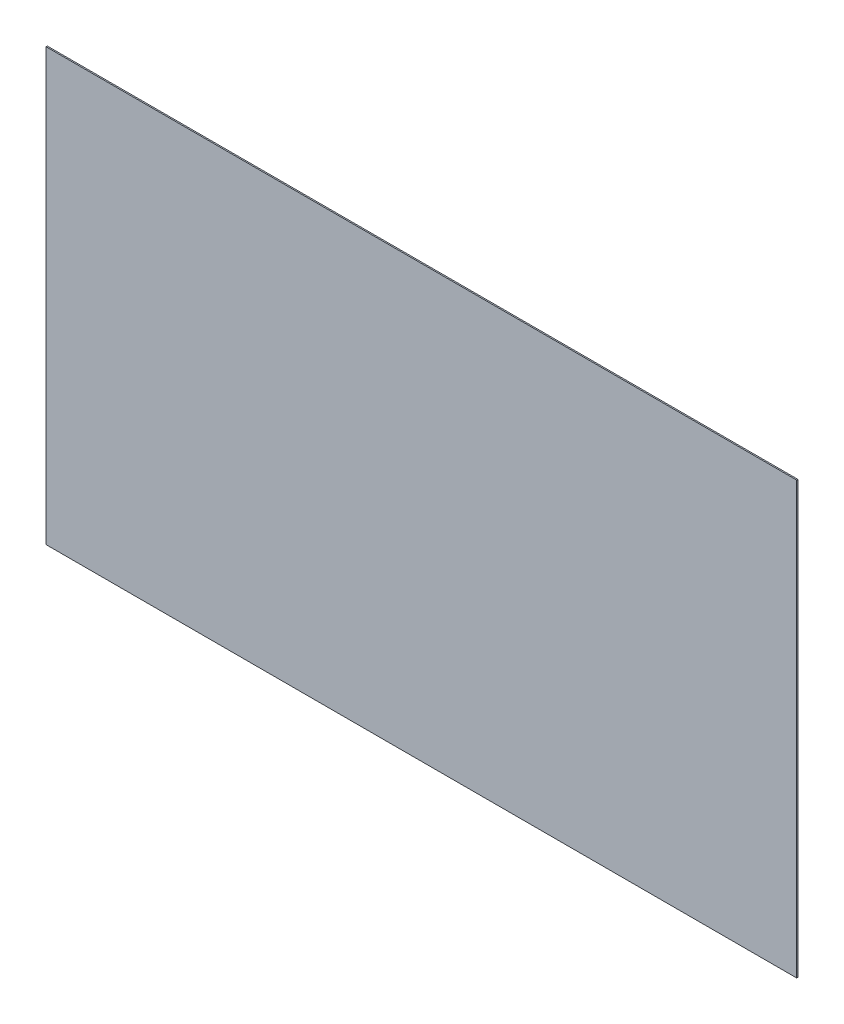
ISO-10303-21;
HEADER;
FILE_DESCRIPTION(('STEP AP214'),'2;1');
FILE_NAME('part.step','',(''),(''),'','','');
FILE_SCHEMA(('AUTOMOTIVE_DESIGN { 1 0 10303 214 1 1 1 1 }'));
ENDSEC;
DATA;
#1=APPLICATION_CONTEXT('core data for automotive mechanical design processes');
#2=APPLICATION_PROTOCOL_DEFINITION('international standard','automotive_design',2000,#1);
#3=PRODUCT_CONTEXT('',#1,'mechanical');
#4=PRODUCT('Part','Part','',(#3));
#5=PRODUCT_RELATED_PRODUCT_CATEGORY('part','',(#4));
#6=PRODUCT_DEFINITION_FORMATION('','',#4);
#7=PRODUCT_DEFINITION_CONTEXT('part definition',#1,'design');
#8=PRODUCT_DEFINITION('design','',#6,#7);
#9=PRODUCT_DEFINITION_SHAPE('','',#8);
#10=(LENGTH_UNIT() NAMED_UNIT(*) SI_UNIT(.MILLI.,.METRE.));
#11=(NAMED_UNIT(*) PLANE_ANGLE_UNIT() SI_UNIT($,.RADIAN.));
#12=(NAMED_UNIT(*) SI_UNIT($,.STERADIAN.) SOLID_ANGLE_UNIT());
#13=UNCERTAINTY_MEASURE_WITH_UNIT(LENGTH_MEASURE(1.E-05),#10,'distance_accuracy_value','');
#14=(GEOMETRIC_REPRESENTATION_CONTEXT(3) GLOBAL_UNCERTAINTY_ASSIGNED_CONTEXT((#13)) GLOBAL_UNIT_ASSIGNED_CONTEXT((#10,
#11,#12)) REPRESENTATION_CONTEXT('',''));
#15=CARTESIAN_POINT('',(0.,0.,0.));
#16=DIRECTION('',(0.,0.,1.));
#17=DIRECTION('',(1.,0.,0.));
#18=AXIS2_PLACEMENT_3D('',#15,#16,#17);
#19=CARTESIAN_POINT('',(298.45,-171.45,1.));
#20=DIRECTION('',(-1.,0.,0.));
#21=DIRECTION('',(0.,0.,1.));
#22=AXIS2_PLACEMENT_3D('',#19,#20,#21);
#23=PLANE('',#22);
#24=DIRECTION('',(0.,1.,0.));
#25=VECTOR('',#24,1.);
#26=CARTESIAN_POINT('',(298.45,-171.45,0.));
#27=LINE('',#26,#25);
#28=CARTESIAN_POINT('',(298.45,-171.45,0.));
#29=VERTEX_POINT('',#28);
#30=CARTESIAN_POINT('',(298.45,171.45,0.));
#31=VERTEX_POINT('',#30);
#32=EDGE_CURVE('E98',#29,#31,#27,.T.);
#33=ORIENTED_EDGE('',*,*,#32,.T.);
#34=DIRECTION('',(0.,0.,-1.));
#35=VECTOR('',#34,1.);
#36=CARTESIAN_POINT('',(298.45,171.45,1.));
#37=LINE('',#36,#35);
#38=CARTESIAN_POINT('',(298.45,171.45,1.));
#39=VERTEX_POINT('',#38);
#40=EDGE_CURVE('E11',#39,#31,#37,.T.);
#41=ORIENTED_EDGE('',*,*,#40,.F.);
#42=DIRECTION('',(0.,1.,0.));
#43=VECTOR('',#42,1.);
#44=CARTESIAN_POINT('',(298.45,-171.45,1.));
#45=LINE('',#44,#43);
#46=CARTESIAN_POINT('',(298.45,-171.45,1.));
#47=VERTEX_POINT('',#46);
#48=EDGE_CURVE('E86',#47,#39,#45,.T.);
#49=ORIENTED_EDGE('',*,*,#48,.F.);
#50=DIRECTION('',(0.,0.,-1.));
#51=VECTOR('',#50,1.);
#52=CARTESIAN_POINT('',(298.45,-171.45,1.));
#53=LINE('',#52,#51);
#54=EDGE_CURVE('E94',#47,#29,#53,.T.);
#55=ORIENTED_EDGE('',*,*,#54,.T.);
#56=EDGE_LOOP('',(#33,#41,#49,#55));
#57=FACE_BOUND('',#56,.T.);
#58=ADVANCED_FACE('F35',(#57),#23,.F.);
#59=CARTESIAN_POINT('',(-298.45,171.45,1.));
#60=DIRECTION('',(0.,-1.,0.));
#61=DIRECTION('',(0.,0.,-1.));
#62=AXIS2_PLACEMENT_3D('',#59,#60,#61);
#63=PLANE('',#62);
#64=DIRECTION('',(-1.,0.,0.));
#65=VECTOR('',#64,1.);
#66=CARTESIAN_POINT('',(-298.45,171.45,0.));
#67=LINE('',#66,#65);
#68=CARTESIAN_POINT('',(-298.45,171.45,0.));
#69=VERTEX_POINT('',#68);
#70=EDGE_CURVE('E90',#31,#69,#67,.T.);
#71=ORIENTED_EDGE('',*,*,#70,.T.);
#72=DIRECTION('',(0.,0.,-1.));
#73=VECTOR('',#72,1.);
#74=CARTESIAN_POINT('',(-298.45,171.45,1.));
#75=LINE('',#74,#73);
#76=CARTESIAN_POINT('',(-298.45,171.45,1.));
#77=VERTEX_POINT('',#76);
#78=EDGE_CURVE('E43',#77,#69,#75,.T.);
#79=ORIENTED_EDGE('',*,*,#78,.F.);
#80=DIRECTION('',(-1.,0.,0.));
#81=VECTOR('',#80,1.);
#82=CARTESIAN_POINT('',(-298.45,171.45,1.));
#83=LINE('',#82,#81);
#84=EDGE_CURVE('E81',#39,#77,#83,.T.);
#85=ORIENTED_EDGE('',*,*,#84,.F.);
#86=ORIENTED_EDGE('',*,*,#40,.T.);
#87=EDGE_LOOP('',(#71,#79,#85,#86));
#88=FACE_BOUND('',#87,.T.);
#89=ADVANCED_FACE('F89',(#88),#63,.F.);
#90=CARTESIAN_POINT('',(-298.45,-171.45,1.));
#91=DIRECTION('',(1.,0.,0.));
#92=DIRECTION('',(0.,0.,-1.));
#93=AXIS2_PLACEMENT_3D('',#90,#91,#92);
#94=PLANE('',#93);
#95=DIRECTION('',(0.,-1.,0.));
#96=VECTOR('',#95,1.);
#97=CARTESIAN_POINT('',(-298.45,-171.45,0.));
#98=LINE('',#97,#96);
#99=CARTESIAN_POINT('',(-298.45,-171.45,0.));
#100=VERTEX_POINT('',#99);
#101=EDGE_CURVE('E68',#69,#100,#98,.T.);
#102=ORIENTED_EDGE('',*,*,#101,.T.);
#103=DIRECTION('',(0.,0.,-1.));
#104=VECTOR('',#103,1.);
#105=CARTESIAN_POINT('',(-298.45,-171.45,1.));
#106=LINE('',#105,#104);
#107=CARTESIAN_POINT('',(-298.45,-171.45,1.));
#108=VERTEX_POINT('',#107);
#109=EDGE_CURVE('E91',#108,#100,#106,.T.);
#110=ORIENTED_EDGE('',*,*,#109,.F.);
#111=DIRECTION('',(0.,-1.,0.));
#112=VECTOR('',#111,1.);
#113=CARTESIAN_POINT('',(-298.45,-171.45,1.));
#114=LINE('',#113,#112);
#115=EDGE_CURVE('E84',#77,#108,#114,.T.);
#116=ORIENTED_EDGE('',*,*,#115,.F.);
#117=ORIENTED_EDGE('',*,*,#78,.T.);
#118=EDGE_LOOP('',(#102,#110,#116,#117));
#119=FACE_BOUND('',#118,.T.);
#120=ADVANCED_FACE('F92',(#119),#94,.F.);
#121=CARTESIAN_POINT('',(-298.45,-171.45,1.));
#122=DIRECTION('',(0.,1.,0.));
#123=DIRECTION('',(0.,0.,1.));
#124=AXIS2_PLACEMENT_3D('',#121,#122,#123);
#125=PLANE('',#124);
#126=DIRECTION('',(1.,0.,0.));
#127=VECTOR('',#126,1.);
#128=CARTESIAN_POINT('',(-298.45,-171.45,0.));
#129=LINE('',#128,#127);
#130=EDGE_CURVE('E74',#100,#29,#129,.T.);
#131=ORIENTED_EDGE('',*,*,#130,.T.);
#132=ORIENTED_EDGE('',*,*,#54,.F.);
#133=DIRECTION('',(1.,0.,0.));
#134=VECTOR('',#133,1.);
#135=CARTESIAN_POINT('',(-298.45,-171.45,1.));
#136=LINE('',#135,#134);
#137=EDGE_CURVE('E51',#108,#47,#136,.T.);
#138=ORIENTED_EDGE('',*,*,#137,.F.);
#139=ORIENTED_EDGE('',*,*,#109,.T.);
#140=EDGE_LOOP('',(#131,#132,#138,#139));
#141=FACE_BOUND('',#140,.T.);
#142=ADVANCED_FACE('F105',(#141),#125,.F.);
#143=CARTESIAN_POINT('',(0.,0.,1.));
#144=DIRECTION('',(0.,0.,-1.));
#145=DIRECTION('',(-1.,0.,0.));
#146=AXIS2_PLACEMENT_3D('',#143,#144,#145);
#147=PLANE('',#146);
#148=ORIENTED_EDGE('',*,*,#48,.T.);
#149=ORIENTED_EDGE('',*,*,#84,.T.);
#150=ORIENTED_EDGE('',*,*,#115,.T.);
#151=ORIENTED_EDGE('',*,*,#137,.T.);
#152=EDGE_LOOP('',(#148,#149,#150,#151));
#153=FACE_BOUND('',#152,.T.);
#154=ADVANCED_FACE('F82',(#153),#147,.F.);
#155=CARTESIAN_POINT('',(0.,0.,0.));
#156=DIRECTION('',(0.,0.,-1.));
#157=DIRECTION('',(-1.,0.,0.));
#158=AXIS2_PLACEMENT_3D('',#155,#156,#157);
#159=PLANE('',#158);
#160=ORIENTED_EDGE('',*,*,#32,.F.);
#161=ORIENTED_EDGE('',*,*,#130,.F.);
#162=ORIENTED_EDGE('',*,*,#101,.F.);
#163=ORIENTED_EDGE('',*,*,#70,.F.);
#164=EDGE_LOOP('',(#160,#161,#162,#163));
#165=FACE_BOUND('',#164,.T.);
#166=ADVANCED_FACE('F108',(#165),#159,.T.);
#167=CLOSED_SHELL('',(#58,#89,#120,#142,#154,#166));
#168=MANIFOLD_SOLID_BREP('B2',#167);
#169=ADVANCED_BREP_SHAPE_REPRESENTATION('',(#18,#168),#14);
#170=SHAPE_DEFINITION_REPRESENTATION(#9,#169);
ENDSEC;
END-ISO-10303-21;
